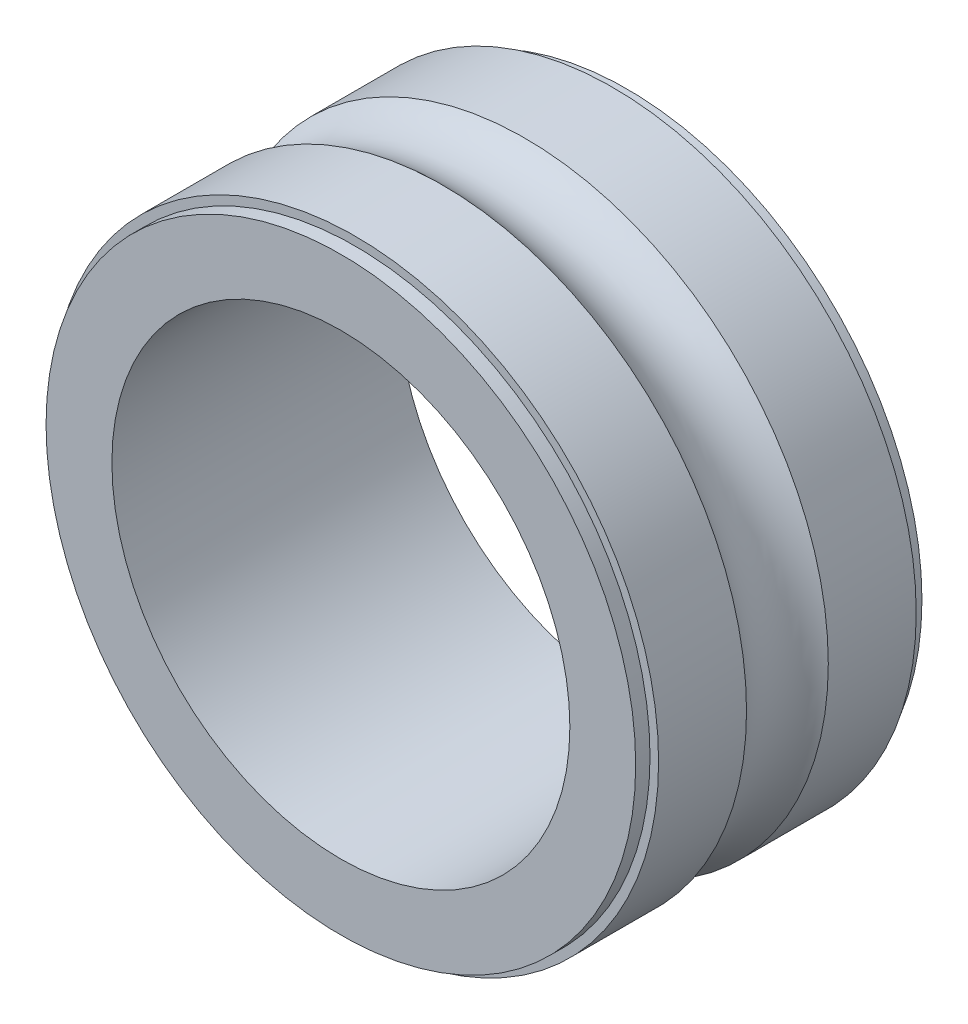
ISO-10303-21;
HEADER;
FILE_DESCRIPTION(('STEP AP214'),'2;1');
FILE_NAME('part.step','',(''),(''),'','','');
FILE_SCHEMA(('AUTOMOTIVE_DESIGN { 1 0 10303 214 1 1 1 1 }'));
ENDSEC;
DATA;
#1=APPLICATION_CONTEXT('core data for automotive mechanical design processes');
#2=APPLICATION_PROTOCOL_DEFINITION('international standard','automotive_design',2000,#1);
#3=PRODUCT_CONTEXT('',#1,'mechanical');
#4=PRODUCT('Part','Part','',(#3));
#5=PRODUCT_RELATED_PRODUCT_CATEGORY('part','',(#4));
#6=PRODUCT_DEFINITION_FORMATION('','',#4);
#7=PRODUCT_DEFINITION_CONTEXT('part definition',#1,'design');
#8=PRODUCT_DEFINITION('design','',#6,#7);
#9=PRODUCT_DEFINITION_SHAPE('','',#8);
#10=(LENGTH_UNIT() NAMED_UNIT(*) SI_UNIT(.MILLI.,.METRE.));
#11=(NAMED_UNIT(*) PLANE_ANGLE_UNIT() SI_UNIT($,.RADIAN.));
#12=(NAMED_UNIT(*) SI_UNIT($,.STERADIAN.) SOLID_ANGLE_UNIT());
#13=UNCERTAINTY_MEASURE_WITH_UNIT(LENGTH_MEASURE(1.E-05),#10,'distance_accuracy_value','');
#14=(GEOMETRIC_REPRESENTATION_CONTEXT(3) GLOBAL_UNCERTAINTY_ASSIGNED_CONTEXT((#13)) GLOBAL_UNIT_ASSIGNED_CONTEXT((#10,
#11,#12)) REPRESENTATION_CONTEXT('',''));
#15=CARTESIAN_POINT('',(0.,0.,0.));
#16=DIRECTION('',(0.,0.,1.));
#17=DIRECTION('',(1.,0.,0.));
#18=AXIS2_PLACEMENT_3D('',#15,#16,#17);
#19=CARTESIAN_POINT('',(0.,0.,6.75539907110854));
#20=DIRECTION('',(0.,0.,1.));
#21=DIRECTION('',(1.,0.,0.));
#22=AXIS2_PLACEMENT_3D('',#19,#20,#21);
#23=CYLINDRICAL_SURFACE('',#22,4.);
#24=CARTESIAN_POINT('',(0.,0.,-2.5));
#25=DIRECTION('',(0.,0.,1.));
#26=DIRECTION('',(1.,0.,0.));
#27=AXIS2_PLACEMENT_3D('',#24,#25,#26);
#28=CIRCLE('',#27,4.);
#29=CARTESIAN_POINT('',(4.,0.,-2.5));
#30=VERTEX_POINT('',#29);
#31=EDGE_CURVE('E10',#30,#30,#28,.T.);
#32=ORIENTED_EDGE('',*,*,#31,.F.);
#33=EDGE_LOOP('',(#32));
#34=FACE_BOUND('',#33,.T.);
#35=CARTESIAN_POINT('',(0.,0.,2.5));
#36=DIRECTION('',(0.,0.,1.));
#37=DIRECTION('',(1.,0.,0.));
#38=AXIS2_PLACEMENT_3D('',#35,#36,#37);
#39=CIRCLE('',#38,4.);
#40=CARTESIAN_POINT('',(4.,0.,2.5));
#41=VERTEX_POINT('',#40);
#42=EDGE_CURVE('E71',#41,#41,#39,.T.);
#43=ORIENTED_EDGE('',*,*,#42,.T.);
#44=EDGE_LOOP('',(#43));
#45=FACE_BOUND('',#44,.T.);
#46=ADVANCED_FACE('F37',(#34,#45),#23,.F.);
#47=CARTESIAN_POINT('',(0.,5.15,-2.5));
#48=DIRECTION('',(0.,0.,1.));
#49=DIRECTION('',(1.,0.,0.));
#50=AXIS2_PLACEMENT_3D('',#47,#48,#49);
#51=PLANE('',#50);
#52=CARTESIAN_POINT('',(0.,0.,-2.5));
#53=DIRECTION('',(0.,0.,1.));
#54=DIRECTION('',(1.,0.,0.));
#55=AXIS2_PLACEMENT_3D('',#52,#53,#54);
#56=CIRCLE('',#55,5.15);
#57=CARTESIAN_POINT('',(5.15,0.,-2.5));
#58=VERTEX_POINT('',#57);
#59=EDGE_CURVE('E43',#58,#58,#56,.T.);
#60=ORIENTED_EDGE('',*,*,#59,.F.);
#61=EDGE_LOOP('',(#60));
#62=FACE_BOUND('',#61,.T.);
#63=ORIENTED_EDGE('',*,*,#31,.T.);
#64=EDGE_LOOP('',(#63));
#65=FACE_BOUND('',#64,.T.);
#66=ADVANCED_FACE('F120',(#62,#65),#51,.F.);
#67=CARTESIAN_POINT('',(0.,0.,6.75539907110854));
#68=DIRECTION('',(0.,0.,1.));
#69=DIRECTION('',(1.,0.,0.));
#70=AXIS2_PLACEMENT_3D('',#67,#68,#69);
#71=CYLINDRICAL_SURFACE('',#70,5.15);
#72=CARTESIAN_POINT('',(0.,0.,-2.25000000000001));
#73=DIRECTION('',(0.,0.,1.));
#74=DIRECTION('',(1.,0.,0.));
#75=AXIS2_PLACEMENT_3D('',#72,#73,#74);
#76=CIRCLE('',#75,5.15);
#77=CARTESIAN_POINT('',(5.15,0.,-2.25000000000001));
#78=VERTEX_POINT('',#77);
#79=EDGE_CURVE('E47',#78,#78,#76,.T.);
#80=ORIENTED_EDGE('',*,*,#79,.F.);
#81=EDGE_LOOP('',(#80));
#82=FACE_BOUND('',#81,.T.);
#83=ORIENTED_EDGE('',*,*,#59,.T.);
#84=EDGE_LOOP('',(#83));
#85=FACE_BOUND('',#84,.T.);
#86=ADVANCED_FACE('F115',(#82,#85),#71,.T.);
#87=CARTESIAN_POINT('',(0.,5.3,-2.25000000000001));
#88=DIRECTION('',(0.,0.,1.));
#89=DIRECTION('',(1.,0.,0.));
#90=AXIS2_PLACEMENT_3D('',#87,#88,#89);
#91=PLANE('',#90);
#92=CARTESIAN_POINT('',(0.,0.,-2.25000000000001));
#93=DIRECTION('',(0.,0.,1.));
#94=DIRECTION('',(1.,0.,0.));
#95=AXIS2_PLACEMENT_3D('',#92,#93,#94);
#96=CIRCLE('',#95,5.3);
#97=CARTESIAN_POINT('',(5.3,0.,-2.25000000000001));
#98=VERTEX_POINT('',#97);
#99=EDGE_CURVE('E51',#98,#98,#96,.T.);
#100=ORIENTED_EDGE('',*,*,#99,.F.);
#101=EDGE_LOOP('',(#100));
#102=FACE_BOUND('',#101,.T.);
#103=ORIENTED_EDGE('',*,*,#79,.T.);
#104=EDGE_LOOP('',(#103));
#105=FACE_BOUND('',#104,.T.);
#106=ADVANCED_FACE('F109',(#102,#105),#91,.F.);
#107=CARTESIAN_POINT('',(0.,0.,6.75539907110854));
#108=DIRECTION('',(0.,0.,1.));
#109=DIRECTION('',(1.,0.,0.));
#110=AXIS2_PLACEMENT_3D('',#107,#108,#109);
#111=CYLINDRICAL_SURFACE('',#110,5.3);
#112=CARTESIAN_POINT('',(0.,0.,-0.714142842854286));
#113=DIRECTION('',(0.,0.,1.));
#114=DIRECTION('',(1.,0.,0.));
#115=AXIS2_PLACEMENT_3D('',#112,#113,#114);
#116=CIRCLE('',#115,5.3);
#117=CARTESIAN_POINT('',(5.3,0.,-0.714142842854286));
#118=VERTEX_POINT('',#117);
#119=EDGE_CURVE('E56',#118,#118,#116,.T.);
#120=ORIENTED_EDGE('',*,*,#119,.F.);
#121=EDGE_LOOP('',(#120));
#122=FACE_BOUND('',#121,.T.);
#123=ORIENTED_EDGE('',*,*,#99,.T.);
#124=EDGE_LOOP('',(#123));
#125=FACE_BOUND('',#124,.T.);
#126=ADVANCED_FACE('F103',(#122,#125),#111,.T.);
#127=CARTESIAN_POINT('',(0.,0.,0.));
#128=DIRECTION('',(0.,0.,1.));
#129=DIRECTION('',(1.,0.,0.));
#130=AXIS2_PLACEMENT_3D('',#127,#128,#129);
#131=TOROIDAL_SURFACE('',#130,6.,1.);
#132=CARTESIAN_POINT('',(0.,0.,0.714142842854288));
#133=DIRECTION('',(0.,0.,1.));
#134=DIRECTION('',(1.,0.,0.));
#135=AXIS2_PLACEMENT_3D('',#132,#133,#134);
#136=CIRCLE('',#135,5.3);
#137=CARTESIAN_POINT('',(5.3,0.,0.714142842854288));
#138=VERTEX_POINT('',#137);
#139=EDGE_CURVE('E59',#138,#138,#136,.T.);
#140=ORIENTED_EDGE('',*,*,#139,.F.);
#141=EDGE_LOOP('',(#140));
#142=FACE_BOUND('',#141,.T.);
#143=ORIENTED_EDGE('',*,*,#119,.T.);
#144=EDGE_LOOP('',(#143));
#145=FACE_BOUND('',#144,.T.);
#146=ADVANCED_FACE('F97',(#142,#145),#131,.F.);
#147=CARTESIAN_POINT('',(0.,0.,6.75539907110854));
#148=DIRECTION('',(0.,0.,1.));
#149=DIRECTION('',(1.,0.,0.));
#150=AXIS2_PLACEMENT_3D('',#147,#148,#149);
#151=CYLINDRICAL_SURFACE('',#150,5.3);
#152=CARTESIAN_POINT('',(0.,0.,2.25000000000001));
#153=DIRECTION('',(0.,0.,1.));
#154=DIRECTION('',(1.,0.,0.));
#155=AXIS2_PLACEMENT_3D('',#152,#153,#154);
#156=CIRCLE('',#155,5.3);
#157=CARTESIAN_POINT('',(5.3,0.,2.25000000000001));
#158=VERTEX_POINT('',#157);
#159=EDGE_CURVE('E62',#158,#158,#156,.T.);
#160=ORIENTED_EDGE('',*,*,#159,.F.);
#161=EDGE_LOOP('',(#160));
#162=FACE_BOUND('',#161,.T.);
#163=ORIENTED_EDGE('',*,*,#139,.T.);
#164=EDGE_LOOP('',(#163));
#165=FACE_BOUND('',#164,.T.);
#166=ADVANCED_FACE('F91',(#162,#165),#151,.T.);
#167=CARTESIAN_POINT('',(0.,5.3,2.25000000000001));
#168=DIRECTION('',(0.,0.,-1.));
#169=DIRECTION('',(-1.,0.,0.));
#170=AXIS2_PLACEMENT_3D('',#167,#168,#169);
#171=PLANE('',#170);
#172=CARTESIAN_POINT('',(0.,0.,2.25000000000001));
#173=DIRECTION('',(0.,0.,1.));
#174=DIRECTION('',(1.,0.,0.));
#175=AXIS2_PLACEMENT_3D('',#172,#173,#174);
#176=CIRCLE('',#175,5.15);
#177=CARTESIAN_POINT('',(5.15,0.,2.25000000000001));
#178=VERTEX_POINT('',#177);
#179=EDGE_CURVE('E65',#178,#178,#176,.T.);
#180=ORIENTED_EDGE('',*,*,#179,.F.);
#181=EDGE_LOOP('',(#180));
#182=FACE_BOUND('',#181,.T.);
#183=ORIENTED_EDGE('',*,*,#159,.T.);
#184=EDGE_LOOP('',(#183));
#185=FACE_BOUND('',#184,.T.);
#186=ADVANCED_FACE('F85',(#182,#185),#171,.F.);
#187=CARTESIAN_POINT('',(0.,0.,6.75539907110854));
#188=DIRECTION('',(0.,0.,1.));
#189=DIRECTION('',(1.,0.,0.));
#190=AXIS2_PLACEMENT_3D('',#187,#188,#189);
#191=CYLINDRICAL_SURFACE('',#190,5.15);
#192=CARTESIAN_POINT('',(0.,0.,2.5));
#193=DIRECTION('',(0.,0.,1.));
#194=DIRECTION('',(1.,0.,0.));
#195=AXIS2_PLACEMENT_3D('',#192,#193,#194);
#196=CIRCLE('',#195,5.15);
#197=CARTESIAN_POINT('',(5.15,0.,2.5));
#198=VERTEX_POINT('',#197);
#199=EDGE_CURVE('E68',#198,#198,#196,.T.);
#200=ORIENTED_EDGE('',*,*,#199,.F.);
#201=EDGE_LOOP('',(#200));
#202=FACE_BOUND('',#201,.T.);
#203=ORIENTED_EDGE('',*,*,#179,.T.);
#204=EDGE_LOOP('',(#203));
#205=FACE_BOUND('',#204,.T.);
#206=ADVANCED_FACE('F79',(#202,#205),#191,.T.);
#207=CARTESIAN_POINT('',(0.,5.15,2.5));
#208=DIRECTION('',(0.,0.,-1.));
#209=DIRECTION('',(-1.,0.,0.));
#210=AXIS2_PLACEMENT_3D('',#207,#208,#209);
#211=PLANE('',#210);
#212=ORIENTED_EDGE('',*,*,#42,.F.);
#213=EDGE_LOOP('',(#212));
#214=FACE_BOUND('',#213,.T.);
#215=ORIENTED_EDGE('',*,*,#199,.T.);
#216=EDGE_LOOP('',(#215));
#217=FACE_BOUND('',#216,.T.);
#218=ADVANCED_FACE('F76',(#214,#217),#211,.F.);
#219=CLOSED_SHELL('',(#46,#66,#86,#106,#126,#146,#166,#186,#206,#218));
#220=MANIFOLD_SOLID_BREP('B2',#219);
#221=ADVANCED_BREP_SHAPE_REPRESENTATION('',(#18,#220),#14);
#222=SHAPE_DEFINITION_REPRESENTATION(#9,#221);
ENDSEC;
END-ISO-10303-21;
